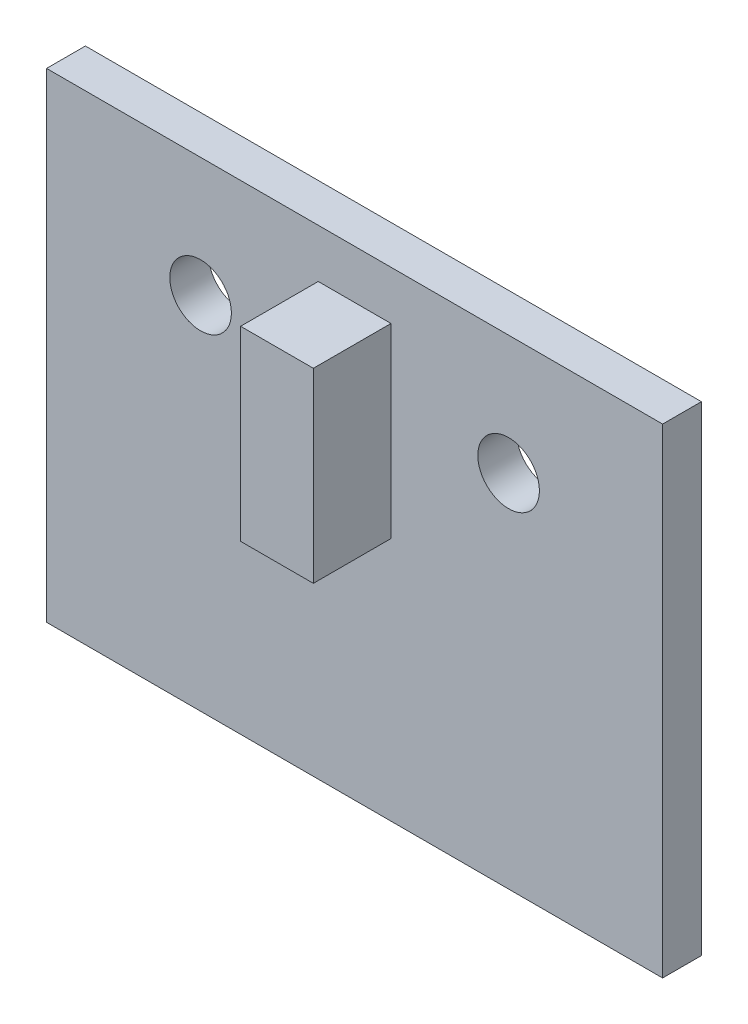
ISO-10303-21;
HEADER;
FILE_DESCRIPTION(('STEP AP214'),'2;1');
FILE_NAME('part.step','',(''),(''),'','','');
FILE_SCHEMA(('AUTOMOTIVE_DESIGN { 1 0 10303 214 1 1 1 1 }'));
ENDSEC;
DATA;
#1=APPLICATION_CONTEXT('core data for automotive mechanical design processes');
#2=APPLICATION_PROTOCOL_DEFINITION('international standard','automotive_design',2000,#1);
#3=PRODUCT_CONTEXT('',#1,'mechanical');
#4=PRODUCT('Part','Part','',(#3));
#5=PRODUCT_RELATED_PRODUCT_CATEGORY('part','',(#4));
#6=PRODUCT_DEFINITION_FORMATION('','',#4);
#7=PRODUCT_DEFINITION_CONTEXT('part definition',#1,'design');
#8=PRODUCT_DEFINITION('design','',#6,#7);
#9=PRODUCT_DEFINITION_SHAPE('','',#8);
#10=(LENGTH_UNIT() NAMED_UNIT(*) SI_UNIT(.MILLI.,.METRE.));
#11=(NAMED_UNIT(*) PLANE_ANGLE_UNIT() SI_UNIT($,.RADIAN.));
#12=(NAMED_UNIT(*) SI_UNIT($,.STERADIAN.) SOLID_ANGLE_UNIT());
#13=UNCERTAINTY_MEASURE_WITH_UNIT(LENGTH_MEASURE(1.E-05),#10,'distance_accuracy_value','');
#14=(GEOMETRIC_REPRESENTATION_CONTEXT(3) GLOBAL_UNCERTAINTY_ASSIGNED_CONTEXT((#13)) GLOBAL_UNIT_ASSIGNED_CONTEXT((#10,
#11,#12)) REPRESENTATION_CONTEXT('',''));
#15=CARTESIAN_POINT('',(0.,0.,0.));
#16=DIRECTION('',(0.,0.,1.));
#17=DIRECTION('',(1.,0.,0.));
#18=AXIS2_PLACEMENT_3D('',#15,#16,#17);
#19=CARTESIAN_POINT('',(-3.75,-42.1526934080095,12.));
#20=DIRECTION('',(-1.,0.,0.));
#21=DIRECTION('',(0.,0.,1.));
#22=AXIS2_PLACEMENT_3D('',#19,#20,#21);
#23=PLANE('',#22);
#24=DIRECTION('',(0.,1.,0.));
#25=VECTOR('',#24,1.);
#26=CARTESIAN_POINT('',(-3.75,-42.1526934080095,0.));
#27=LINE('',#26,#25);
#28=CARTESIAN_POINT('',(-3.75,21.095,0.));
#29=VERTEX_POINT('',#28);
#30=CARTESIAN_POINT('',(-3.75,40.295,0.));
#31=VERTEX_POINT('',#30);
#32=EDGE_CURVE('E108',#29,#31,#27,.T.);
#33=ORIENTED_EDGE('',*,*,#32,.F.);
#34=DIRECTION('',(0.,0.,-1.));
#35=VECTOR('',#34,1.);
#36=CARTESIAN_POINT('',(-3.75,21.095,12.));
#37=LINE('',#36,#35);
#38=CARTESIAN_POINT('',(-3.75,21.095,12.));
#39=VERTEX_POINT('',#38);
#40=EDGE_CURVE('E12',#39,#29,#37,.T.);
#41=ORIENTED_EDGE('',*,*,#40,.F.);
#42=DIRECTION('',(0.,1.,0.));
#43=VECTOR('',#42,1.);
#44=CARTESIAN_POINT('',(-3.75,-42.1526934080095,12.));
#45=LINE('',#44,#43);
#46=CARTESIAN_POINT('',(-3.75,40.295,12.));
#47=VERTEX_POINT('',#46);
#48=EDGE_CURVE('E100',#39,#47,#45,.T.);
#49=ORIENTED_EDGE('',*,*,#48,.T.);
#50=DIRECTION('',(0.,0.,-1.));
#51=VECTOR('',#50,1.);
#52=CARTESIAN_POINT('',(-3.75,40.295,12.));
#53=LINE('',#52,#51);
#54=EDGE_CURVE('E61',#47,#31,#53,.T.);
#55=ORIENTED_EDGE('',*,*,#54,.T.);
#56=EDGE_LOOP('',(#33,#41,#49,#55));
#57=FACE_BOUND('',#56,.T.);
#58=ADVANCED_FACE('F45',(#57),#23,.T.);
#59=CARTESIAN_POINT('',(0.,21.095,12.));
#60=DIRECTION('',(0.,-1.,0.));
#61=DIRECTION('',(0.,0.,-1.));
#62=AXIS2_PLACEMENT_3D('',#59,#60,#61);
#63=PLANE('',#62);
#64=DIRECTION('',(-1.,0.,0.));
#65=VECTOR('',#64,1.);
#66=CARTESIAN_POINT('',(0.,21.095,0.));
#67=LINE('',#66,#65);
#68=CARTESIAN_POINT('',(3.75,21.095,0.));
#69=VERTEX_POINT('',#68);
#70=EDGE_CURVE('E91',#69,#29,#67,.T.);
#71=ORIENTED_EDGE('',*,*,#70,.F.);
#72=DIRECTION('',(0.,0.,-1.));
#73=VECTOR('',#72,1.);
#74=CARTESIAN_POINT('',(3.75,21.095,12.));
#75=LINE('',#74,#73);
#76=CARTESIAN_POINT('',(3.75,21.095,12.));
#77=VERTEX_POINT('',#76);
#78=EDGE_CURVE('E53',#77,#69,#75,.T.);
#79=ORIENTED_EDGE('',*,*,#78,.F.);
#80=DIRECTION('',(-1.,0.,0.));
#81=VECTOR('',#80,1.);
#82=CARTESIAN_POINT('',(0.,21.095,12.));
#83=LINE('',#82,#81);
#84=EDGE_CURVE('E89',#77,#39,#83,.T.);
#85=ORIENTED_EDGE('',*,*,#84,.T.);
#86=ORIENTED_EDGE('',*,*,#40,.T.);
#87=EDGE_LOOP('',(#71,#79,#85,#86));
#88=FACE_BOUND('',#87,.T.);
#89=ADVANCED_FACE('F88',(#88),#63,.T.);
#90=CARTESIAN_POINT('',(3.75,-42.1526934080095,12.));
#91=DIRECTION('',(1.,0.,0.));
#92=DIRECTION('',(0.,1.,0.));
#93=AXIS2_PLACEMENT_3D('',#90,#91,#92);
#94=PLANE('',#93);
#95=DIRECTION('',(0.,-1.,0.));
#96=VECTOR('',#95,1.);
#97=CARTESIAN_POINT('',(3.75,-42.1526934080095,0.));
#98=LINE('',#97,#96);
#99=CARTESIAN_POINT('',(3.75,40.295,0.));
#100=VERTEX_POINT('',#99);
#101=EDGE_CURVE('E111',#100,#69,#98,.T.);
#102=ORIENTED_EDGE('',*,*,#101,.F.);
#103=DIRECTION('',(0.,0.,-1.));
#104=VECTOR('',#103,1.);
#105=CARTESIAN_POINT('',(3.75,40.295,12.));
#106=LINE('',#105,#104);
#107=CARTESIAN_POINT('',(3.75,40.295,12.));
#108=VERTEX_POINT('',#107);
#109=EDGE_CURVE('E74',#108,#100,#106,.T.);
#110=ORIENTED_EDGE('',*,*,#109,.F.);
#111=DIRECTION('',(0.,-1.,0.));
#112=VECTOR('',#111,1.);
#113=CARTESIAN_POINT('',(3.75,-42.1526934080095,12.));
#114=LINE('',#113,#112);
#115=EDGE_CURVE('E99',#108,#77,#114,.T.);
#116=ORIENTED_EDGE('',*,*,#115,.T.);
#117=ORIENTED_EDGE('',*,*,#78,.T.);
#118=EDGE_LOOP('',(#102,#110,#116,#117));
#119=FACE_BOUND('',#118,.T.);
#120=ADVANCED_FACE('F102',(#119),#94,.T.);
#121=CARTESIAN_POINT('',(0.,40.295,12.));
#122=DIRECTION('',(0.,1.,0.));
#123=DIRECTION('',(0.,0.,1.));
#124=AXIS2_PLACEMENT_3D('',#121,#122,#123);
#125=PLANE('',#124);
#126=DIRECTION('',(1.,0.,0.));
#127=VECTOR('',#126,1.);
#128=CARTESIAN_POINT('',(0.,40.295,0.));
#129=LINE('',#128,#127);
#130=EDGE_CURVE('E113',#31,#100,#129,.T.);
#131=ORIENTED_EDGE('',*,*,#130,.F.);
#132=ORIENTED_EDGE('',*,*,#54,.F.);
#133=DIRECTION('',(1.,0.,0.));
#134=VECTOR('',#133,1.);
#135=CARTESIAN_POINT('',(0.,40.295,12.));
#136=LINE('',#135,#134);
#137=EDGE_CURVE('E103',#47,#108,#136,.T.);
#138=ORIENTED_EDGE('',*,*,#137,.T.);
#139=ORIENTED_EDGE('',*,*,#109,.T.);
#140=EDGE_LOOP('',(#131,#132,#138,#139));
#141=FACE_BOUND('',#140,.T.);
#142=ADVANCED_FACE('F118',(#141),#125,.T.);
#143=CARTESIAN_POINT('',(0.,-42.1526934080095,12.));
#144=DIRECTION('',(0.,0.,1.));
#145=DIRECTION('',(1.,0.,0.));
#146=AXIS2_PLACEMENT_3D('',#143,#144,#145);
#147=PLANE('',#146);
#148=ORIENTED_EDGE('',*,*,#48,.F.);
#149=ORIENTED_EDGE('',*,*,#84,.F.);
#150=ORIENTED_EDGE('',*,*,#115,.F.);
#151=ORIENTED_EDGE('',*,*,#137,.F.);
#152=EDGE_LOOP('',(#148,#149,#150,#151));
#153=FACE_BOUND('',#152,.T.);
#154=ADVANCED_FACE('F97',(#153),#147,.T.);
#155=CARTESIAN_POINT('',(0.,-42.1526934080095,0.));
#156=DIRECTION('',(0.,0.,1.));
#157=DIRECTION('',(1.,0.,0.));
#158=AXIS2_PLACEMENT_3D('',#155,#156,#157);
#159=PLANE('',#158);
#160=ORIENTED_EDGE('',*,*,#32,.T.);
#161=ORIENTED_EDGE('',*,*,#130,.T.);
#162=ORIENTED_EDGE('',*,*,#101,.T.);
#163=ORIENTED_EDGE('',*,*,#70,.T.);
#164=EDGE_LOOP('',(#160,#161,#162,#163));
#165=FACE_BOUND('',#164,.T.);
#166=ADVANCED_FACE('F125',(#165),#159,.F.);
#167=CLOSED_SHELL('',(#58,#89,#120,#142,#154,#166));
#168=MANIFOLD_SOLID_BREP('B2',#167);
#169=CARTESIAN_POINT('',(0.,21.095,4.));
#170=DIRECTION('',(0.,-1.,0.));
#171=DIRECTION('',(0.,0.,-1.));
#172=AXIS2_PLACEMENT_3D('',#169,#170,#171);
#173=PLANE('',#172);
#174=DIRECTION('',(-1.,0.,0.));
#175=VECTOR('',#174,1.);
#176=CARTESIAN_POINT('',(0.,21.095,0.));
#177=LINE('',#176,#175);
#178=CARTESIAN_POINT('',(3.75,21.095,0.));
#179=VERTEX_POINT('',#178);
#180=CARTESIAN_POINT('',(-3.75,21.095,0.));
#181=VERTEX_POINT('',#180);
#182=EDGE_CURVE('E286',#179,#181,#177,.T.);
#183=ORIENTED_EDGE('',*,*,#182,.T.);
#184=DIRECTION('',(0.,0.,-1.));
#185=VECTOR('',#184,1.);
#186=CARTESIAN_POINT('',(-3.75,21.095,4.));
#187=LINE('',#186,#185);
#188=CARTESIAN_POINT('',(-3.75,21.095,4.));
#189=VERTEX_POINT('',#188);
#190=EDGE_CURVE('E43',#189,#181,#187,.T.);
#191=ORIENTED_EDGE('',*,*,#190,.F.);
#192=DIRECTION('',(-1.,0.,0.));
#193=VECTOR('',#192,1.);
#194=CARTESIAN_POINT('',(0.,21.095,4.));
#195=LINE('',#194,#193);
#196=CARTESIAN_POINT('',(3.75,21.095,4.));
#197=VERTEX_POINT('',#196);
#198=EDGE_CURVE('E252',#197,#189,#195,.T.);
#199=ORIENTED_EDGE('',*,*,#198,.F.);
#200=DIRECTION('',(0.,0.,-1.));
#201=VECTOR('',#200,1.);
#202=CARTESIAN_POINT('',(3.75,21.095,4.));
#203=LINE('',#202,#201);
#204=EDGE_CURVE('E294',#197,#179,#203,.T.);
#205=ORIENTED_EDGE('',*,*,#204,.T.);
#206=EDGE_LOOP('',(#183,#191,#199,#205));
#207=FACE_BOUND('',#206,.T.);
#208=ADVANCED_FACE('F175',(#207),#173,.F.);
#209=CARTESIAN_POINT('',(-3.75,-42.1526934080095,4.));
#210=DIRECTION('',(-1.,0.,0.));
#211=DIRECTION('',(0.,0.,1.));
#212=AXIS2_PLACEMENT_3D('',#209,#210,#211);
#213=PLANE('',#212);
#214=DIRECTION('',(0.,1.,0.));
#215=VECTOR('',#214,1.);
#216=CARTESIAN_POINT('',(-3.75,-42.1526934080095,0.));
#217=LINE('',#216,#215);
#218=CARTESIAN_POINT('',(-3.75,40.295,0.));
#219=VERTEX_POINT('',#218);
#220=EDGE_CURVE('E258',#181,#219,#217,.T.);
#221=ORIENTED_EDGE('',*,*,#220,.T.);
#222=DIRECTION('',(0.,0.,-1.));
#223=VECTOR('',#222,1.);
#224=CARTESIAN_POINT('',(-3.75,40.295,4.));
#225=LINE('',#224,#223);
#226=CARTESIAN_POINT('',(-3.75,40.295,4.));
#227=VERTEX_POINT('',#226);
#228=EDGE_CURVE('E185',#227,#219,#225,.T.);
#229=ORIENTED_EDGE('',*,*,#228,.F.);
#230=DIRECTION('',(0.,1.,0.));
#231=VECTOR('',#230,1.);
#232=CARTESIAN_POINT('',(-3.75,-42.1526934080095,4.));
#233=LINE('',#232,#231);
#234=EDGE_CURVE('E246',#189,#227,#233,.T.);
#235=ORIENTED_EDGE('',*,*,#234,.F.);
#236=ORIENTED_EDGE('',*,*,#190,.T.);
#237=EDGE_LOOP('',(#221,#229,#235,#236));
#238=FACE_BOUND('',#237,.T.);
#239=ADVANCED_FACE('F257',(#238),#213,.F.);
#240=CARTESIAN_POINT('',(0.,40.295,4.));
#241=DIRECTION('',(0.,-1.,0.));
#242=DIRECTION('',(0.,0.,-1.));
#243=AXIS2_PLACEMENT_3D('',#240,#241,#242);
#244=PLANE('',#243);
#245=DIRECTION('',(-1.,0.,0.));
#246=VECTOR('',#245,1.);
#247=CARTESIAN_POINT('',(0.,40.295,0.));
#248=LINE('',#247,#246);
#249=CARTESIAN_POINT('',(3.75,40.295,0.));
#250=VERTEX_POINT('',#249);
#251=EDGE_CURVE('E290',#250,#219,#248,.T.);
#252=ORIENTED_EDGE('',*,*,#251,.F.);
#253=DIRECTION('',(0.,0.,-1.));
#254=VECTOR('',#253,1.);
#255=CARTESIAN_POINT('',(3.75,40.295,4.));
#256=LINE('',#255,#254);
#257=CARTESIAN_POINT('',(3.75,40.295,4.));
#258=VERTEX_POINT('',#257);
#259=EDGE_CURVE('E222',#258,#250,#256,.T.);
#260=ORIENTED_EDGE('',*,*,#259,.F.);
#261=DIRECTION('',(-1.,0.,0.));
#262=VECTOR('',#261,1.);
#263=CARTESIAN_POINT('',(0.,40.295,4.));
#264=LINE('',#263,#262);
#265=EDGE_CURVE('E250',#258,#227,#264,.T.);
#266=ORIENTED_EDGE('',*,*,#265,.T.);
#267=ORIENTED_EDGE('',*,*,#228,.T.);
#268=EDGE_LOOP('',(#252,#260,#266,#267));
#269=FACE_BOUND('',#268,.T.);
#270=ADVANCED_FACE('F263',(#269),#244,.T.);
#271=CARTESIAN_POINT('',(0.,45.315,4.));
#272=DIRECTION('',(0.,1.,0.));
#273=DIRECTION('',(0.,0.,1.));
#274=AXIS2_PLACEMENT_3D('',#271,#272,#273);
#275=PLANE('',#274);
#276=DIRECTION('',(1.,0.,0.));
#277=VECTOR('',#276,1.);
#278=CARTESIAN_POINT('',(0.,45.315,0.));
#279=LINE('',#278,#277);
#280=CARTESIAN_POINT('',(-31.75,45.315,0.));
#281=VERTEX_POINT('',#280);
#282=CARTESIAN_POINT('',(31.75,45.315,0.));
#283=VERTEX_POINT('',#282);
#284=EDGE_CURVE('E269',#281,#283,#279,.T.);
#285=ORIENTED_EDGE('',*,*,#284,.F.);
#286=DIRECTION('',(0.,0.,-1.));
#287=VECTOR('',#286,1.);
#288=CARTESIAN_POINT('',(-31.75,45.315,4.));
#289=LINE('',#288,#287);
#290=CARTESIAN_POINT('',(-31.75,45.315,4.));
#291=VERTEX_POINT('',#290);
#292=EDGE_CURVE('E179',#291,#281,#289,.T.);
#293=ORIENTED_EDGE('',*,*,#292,.F.);
#294=DIRECTION('',(1.,0.,0.));
#295=VECTOR('',#294,1.);
#296=CARTESIAN_POINT('',(0.,45.315,4.));
#297=LINE('',#296,#295);
#298=CARTESIAN_POINT('',(31.75,45.315,4.));
#299=VERTEX_POINT('',#298);
#300=EDGE_CURVE('E293',#291,#299,#297,.T.);
#301=ORIENTED_EDGE('',*,*,#300,.T.);
#302=DIRECTION('',(0.,0.,-1.));
#303=VECTOR('',#302,1.);
#304=CARTESIAN_POINT('',(31.75,45.315,4.));
#305=LINE('',#304,#303);
#306=EDGE_CURVE('E265',#299,#283,#305,.T.);
#307=ORIENTED_EDGE('',*,*,#306,.T.);
#308=EDGE_LOOP('',(#285,#293,#301,#307));
#309=FACE_BOUND('',#308,.T.);
#310=ADVANCED_FACE('F177',(#309),#275,.T.);
#311=CARTESIAN_POINT('',(-31.75,-42.1526934080095,4.));
#312=DIRECTION('',(1.,0.,0.));
#313=DIRECTION('',(0.,1.,0.));
#314=AXIS2_PLACEMENT_3D('',#311,#312,#313);
#315=PLANE('',#314);
#316=DIRECTION('',(0.,-1.,0.));
#317=VECTOR('',#316,1.);
#318=CARTESIAN_POINT('',(-31.75,-42.1526934080095,0.));
#319=LINE('',#318,#317);
#320=CARTESIAN_POINT('',(-31.75,-4.135,0.));
#321=VERTEX_POINT('',#320);
#322=EDGE_CURVE('E272',#281,#321,#319,.T.);
#323=ORIENTED_EDGE('',*,*,#322,.T.);
#324=DIRECTION('',(0.,0.,-1.));
#325=VECTOR('',#324,1.);
#326=CARTESIAN_POINT('',(-31.75,-4.135,4.));
#327=LINE('',#326,#325);
#328=CARTESIAN_POINT('',(-31.75,-4.135,4.));
#329=VERTEX_POINT('',#328);
#330=EDGE_CURVE('E299',#329,#321,#327,.T.);
#331=ORIENTED_EDGE('',*,*,#330,.F.);
#332=DIRECTION('',(0.,-1.,0.));
#333=VECTOR('',#332,1.);
#334=CARTESIAN_POINT('',(-31.75,-42.1526934080095,4.));
#335=LINE('',#334,#333);
#336=EDGE_CURVE('E308',#291,#329,#335,.T.);
#337=ORIENTED_EDGE('',*,*,#336,.F.);
#338=ORIENTED_EDGE('',*,*,#292,.T.);
#339=EDGE_LOOP('',(#323,#331,#337,#338));
#340=FACE_BOUND('',#339,.T.);
#341=ADVANCED_FACE('F307',(#340),#315,.F.);
#342=CARTESIAN_POINT('',(0.,-4.135,4.));
#343=DIRECTION('',(0.,1.,0.));
#344=DIRECTION('',(0.,0.,1.));
#345=AXIS2_PLACEMENT_3D('',#342,#343,#344);
#346=PLANE('',#345);
#347=DIRECTION('',(1.,0.,0.));
#348=VECTOR('',#347,1.);
#349=CARTESIAN_POINT('',(0.,-4.135,0.));
#350=LINE('',#349,#348);
#351=CARTESIAN_POINT('',(31.75,-4.135,0.));
#352=VERTEX_POINT('',#351);
#353=EDGE_CURVE('E274',#321,#352,#350,.T.);
#354=ORIENTED_EDGE('',*,*,#353,.T.);
#355=DIRECTION('',(0.,0.,-1.));
#356=VECTOR('',#355,1.);
#357=CARTESIAN_POINT('',(31.75,-4.135,4.));
#358=LINE('',#357,#356);
#359=CARTESIAN_POINT('',(31.75,-4.135,4.));
#360=VERTEX_POINT('',#359);
#361=EDGE_CURVE('E298',#360,#352,#358,.T.);
#362=ORIENTED_EDGE('',*,*,#361,.F.);
#363=DIRECTION('',(1.,0.,0.));
#364=VECTOR('',#363,1.);
#365=CARTESIAN_POINT('',(0.,-4.135,4.));
#366=LINE('',#365,#364);
#367=EDGE_CURVE('E452',#329,#360,#366,.T.);
#368=ORIENTED_EDGE('',*,*,#367,.F.);
#369=ORIENTED_EDGE('',*,*,#330,.T.);
#370=EDGE_LOOP('',(#354,#362,#368,#369));
#371=FACE_BOUND('',#370,.T.);
#372=ADVANCED_FACE('F320',(#371),#346,.F.);
#373=CARTESIAN_POINT('',(-15.875,33.,4.));
#374=DIRECTION('',(0.,0.,-1.));
#375=DIRECTION('',(-1.,0.,0.));
#376=AXIS2_PLACEMENT_3D('',#373,#374,#375);
#377=CYLINDRICAL_SURFACE('',#376,3.175);
#378=CARTESIAN_POINT('',(-15.875,33.,4.));
#379=DIRECTION('',(0.,0.,1.));
#380=DIRECTION('',(1.,0.,0.));
#381=AXIS2_PLACEMENT_3D('',#378,#379,#380);
#382=CIRCLE('',#381,3.175);
#383=CARTESIAN_POINT('',(-12.7,33.,4.));
#384=VERTEX_POINT('',#383);
#385=EDGE_CURVE('E447',#384,#384,#382,.T.);
#386=ORIENTED_EDGE('',*,*,#385,.T.);
#387=EDGE_LOOP('',(#386));
#388=FACE_BOUND('',#387,.T.);
#389=CARTESIAN_POINT('',(-15.875,33.,0.));
#390=DIRECTION('',(0.,0.,1.));
#391=DIRECTION('',(1.,0.,0.));
#392=AXIS2_PLACEMENT_3D('',#389,#390,#391);
#393=CIRCLE('',#392,3.175);
#394=CARTESIAN_POINT('',(-12.7,33.,0.));
#395=VERTEX_POINT('',#394);
#396=EDGE_CURVE('E283',#395,#395,#393,.T.);
#397=ORIENTED_EDGE('',*,*,#396,.F.);
#398=EDGE_LOOP('',(#397));
#399=FACE_BOUND('',#398,.T.);
#400=ADVANCED_FACE('F322',(#388,#399),#377,.F.);
#401=CARTESIAN_POINT('',(15.875,33.,4.));
#402=DIRECTION('',(0.,0.,-1.));
#403=DIRECTION('',(-1.,0.,0.));
#404=AXIS2_PLACEMENT_3D('',#401,#402,#403);
#405=CYLINDRICAL_SURFACE('',#404,3.175);
#406=CARTESIAN_POINT('',(15.875,33.,4.));
#407=DIRECTION('',(0.,0.,1.));
#408=DIRECTION('',(1.,0.,0.));
#409=AXIS2_PLACEMENT_3D('',#406,#407,#408);
#410=CIRCLE('',#409,3.175);
#411=CARTESIAN_POINT('',(19.05,33.,4.));
#412=VERTEX_POINT('',#411);
#413=EDGE_CURVE('E444',#412,#412,#410,.T.);
#414=ORIENTED_EDGE('',*,*,#413,.T.);
#415=EDGE_LOOP('',(#414));
#416=FACE_BOUND('',#415,.T.);
#417=CARTESIAN_POINT('',(15.875,33.,0.));
#418=DIRECTION('',(0.,0.,1.));
#419=DIRECTION('',(1.,0.,0.));
#420=AXIS2_PLACEMENT_3D('',#417,#418,#419);
#421=CIRCLE('',#420,3.175);
#422=CARTESIAN_POINT('',(19.05,33.,0.));
#423=VERTEX_POINT('',#422);
#424=EDGE_CURVE('E280',#423,#423,#421,.T.);
#425=ORIENTED_EDGE('',*,*,#424,.F.);
#426=EDGE_LOOP('',(#425));
#427=FACE_BOUND('',#426,.T.);
#428=ADVANCED_FACE('F328',(#416,#427),#405,.F.);
#429=CARTESIAN_POINT('',(31.75,-42.1526934080095,4.));
#430=DIRECTION('',(1.,0.,0.));
#431=DIRECTION('',(0.,0.,-1.));
#432=AXIS2_PLACEMENT_3D('',#429,#430,#431);
#433=PLANE('',#432);
#434=DIRECTION('',(0.,-1.,0.));
#435=VECTOR('',#434,1.);
#436=CARTESIAN_POINT('',(31.75,-42.1526934080095,0.));
#437=LINE('',#436,#435);
#438=EDGE_CURVE('E277',#283,#352,#437,.T.);
#439=ORIENTED_EDGE('',*,*,#438,.F.);
#440=ORIENTED_EDGE('',*,*,#306,.F.);
#441=DIRECTION('',(0.,-1.,0.));
#442=VECTOR('',#441,1.);
#443=CARTESIAN_POINT('',(31.75,-42.1526934080095,4.));
#444=LINE('',#443,#442);
#445=EDGE_CURVE('E318',#299,#360,#444,.T.);
#446=ORIENTED_EDGE('',*,*,#445,.T.);
#447=ORIENTED_EDGE('',*,*,#361,.T.);
#448=EDGE_LOOP('',(#439,#440,#446,#447));
#449=FACE_BOUND('',#448,.T.);
#450=ADVANCED_FACE('F317',(#449),#433,.T.);
#451=CARTESIAN_POINT('',(3.75,-42.1526934080095,4.));
#452=DIRECTION('',(1.,0.,0.));
#453=DIRECTION('',(0.,1.,0.));
#454=AXIS2_PLACEMENT_3D('',#451,#452,#453);
#455=PLANE('',#454);
#456=DIRECTION('',(0.,-1.,0.));
#457=VECTOR('',#456,1.);
#458=CARTESIAN_POINT('',(3.75,-42.1526934080095,0.));
#459=LINE('',#458,#457);
#460=EDGE_CURVE('E225',#250,#179,#459,.T.);
#461=ORIENTED_EDGE('',*,*,#460,.T.);
#462=ORIENTED_EDGE('',*,*,#204,.F.);
#463=DIRECTION('',(0.,-1.,0.));
#464=VECTOR('',#463,1.);
#465=CARTESIAN_POINT('',(3.75,-42.1526934080095,4.));
#466=LINE('',#465,#464);
#467=EDGE_CURVE('E194',#258,#197,#466,.T.);
#468=ORIENTED_EDGE('',*,*,#467,.F.);
#469=ORIENTED_EDGE('',*,*,#259,.T.);
#470=EDGE_LOOP('',(#461,#462,#468,#469));
#471=FACE_BOUND('',#470,.T.);
#472=ADVANCED_FACE('F344',(#471),#455,.F.);
#473=CARTESIAN_POINT('',(0.,-42.1526934080095,4.));
#474=DIRECTION('',(0.,0.,1.));
#475=DIRECTION('',(1.,0.,0.));
#476=AXIS2_PLACEMENT_3D('',#473,#474,#475);
#477=PLANE('',#476);
#478=ORIENTED_EDGE('',*,*,#300,.F.);
#479=ORIENTED_EDGE('',*,*,#336,.T.);
#480=ORIENTED_EDGE('',*,*,#367,.T.);
#481=ORIENTED_EDGE('',*,*,#445,.F.);
#482=EDGE_LOOP('',(#478,#479,#480,#481));
#483=FACE_BOUND('',#482,.T.);
#484=ORIENTED_EDGE('',*,*,#413,.F.);
#485=EDGE_LOOP('',(#484));
#486=FACE_BOUND('',#485,.T.);
#487=ORIENTED_EDGE('',*,*,#385,.F.);
#488=EDGE_LOOP('',(#487));
#489=FACE_BOUND('',#488,.T.);
#490=ORIENTED_EDGE('',*,*,#198,.T.);
#491=ORIENTED_EDGE('',*,*,#234,.T.);
#492=ORIENTED_EDGE('',*,*,#265,.F.);
#493=ORIENTED_EDGE('',*,*,#467,.T.);
#494=EDGE_LOOP('',(#490,#491,#492,#493));
#495=FACE_BOUND('',#494,.T.);
#496=ADVANCED_FACE('F248',(#483,#486,#489,#495),#477,.T.);
#497=CARTESIAN_POINT('',(0.,-42.1526934080095,0.));
#498=DIRECTION('',(0.,0.,1.));
#499=DIRECTION('',(1.,0.,0.));
#500=AXIS2_PLACEMENT_3D('',#497,#498,#499);
#501=PLANE('',#500);
#502=ORIENTED_EDGE('',*,*,#284,.T.);
#503=ORIENTED_EDGE('',*,*,#438,.T.);
#504=ORIENTED_EDGE('',*,*,#353,.F.);
#505=ORIENTED_EDGE('',*,*,#322,.F.);
#506=EDGE_LOOP('',(#502,#503,#504,#505));
#507=FACE_BOUND('',#506,.T.);
#508=ORIENTED_EDGE('',*,*,#424,.T.);
#509=EDGE_LOOP('',(#508));
#510=FACE_BOUND('',#509,.T.);
#511=ORIENTED_EDGE('',*,*,#396,.T.);
#512=EDGE_LOOP('',(#511));
#513=FACE_BOUND('',#512,.T.);
#514=ORIENTED_EDGE('',*,*,#182,.F.);
#515=ORIENTED_EDGE('',*,*,#460,.F.);
#516=ORIENTED_EDGE('',*,*,#251,.T.);
#517=ORIENTED_EDGE('',*,*,#220,.F.);
#518=EDGE_LOOP('',(#514,#515,#516,#517));
#519=FACE_BOUND('',#518,.T.);
#520=ADVANCED_FACE('F311',(#507,#510,#513,#519),#501,.F.);
#521=CLOSED_SHELL('',(#208,#239,#270,#310,#341,#372,#400,#428,#450,#472,#496,#520));
#522=MANIFOLD_SOLID_BREP('B6',#521);
#523=ADVANCED_BREP_SHAPE_REPRESENTATION('',(#18,#168,#522),#14);
#524=SHAPE_DEFINITION_REPRESENTATION(#9,#523);
ENDSEC;
END-ISO-10303-21;
